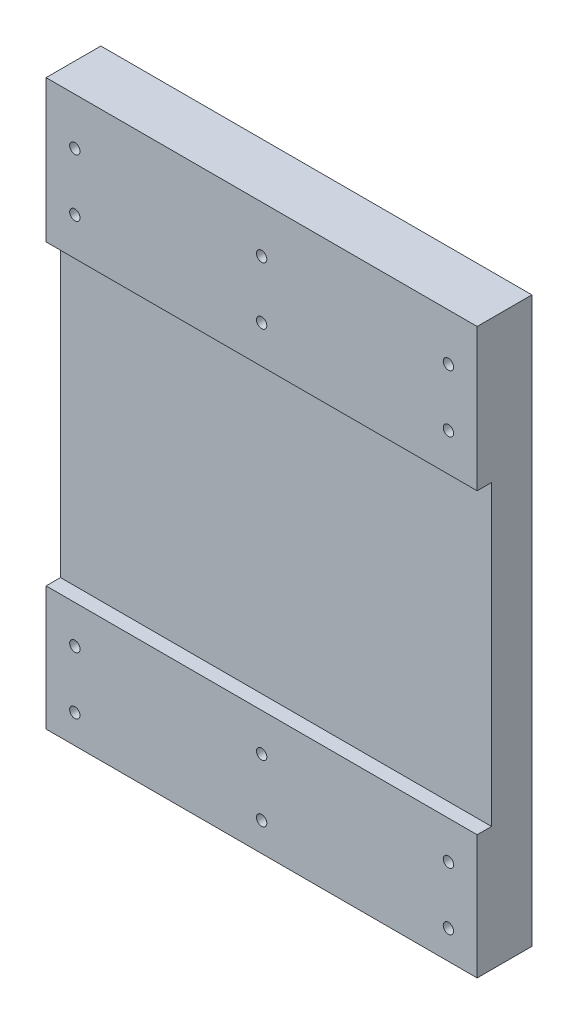
ISO-10303-21;
HEADER;
FILE_DESCRIPTION(('STEP AP214'),'2;1');
FILE_NAME('part.step','',(''),(''),'','','');
FILE_SCHEMA(('AUTOMOTIVE_DESIGN { 1 0 10303 214 1 1 1 1 }'));
ENDSEC;
DATA;
#1=APPLICATION_CONTEXT('core data for automotive mechanical design processes');
#2=APPLICATION_PROTOCOL_DEFINITION('international standard','automotive_design',2000,#1);
#3=PRODUCT_CONTEXT('',#1,'mechanical');
#4=PRODUCT('Part','Part','',(#3));
#5=PRODUCT_RELATED_PRODUCT_CATEGORY('part','',(#4));
#6=PRODUCT_DEFINITION_FORMATION('','',#4);
#7=PRODUCT_DEFINITION_CONTEXT('part definition',#1,'design');
#8=PRODUCT_DEFINITION('design','',#6,#7);
#9=PRODUCT_DEFINITION_SHAPE('','',#8);
#10=(LENGTH_UNIT() NAMED_UNIT(*) SI_UNIT(.MILLI.,.METRE.));
#11=(NAMED_UNIT(*) PLANE_ANGLE_UNIT() SI_UNIT($,.RADIAN.));
#12=(NAMED_UNIT(*) SI_UNIT($,.STERADIAN.) SOLID_ANGLE_UNIT());
#13=UNCERTAINTY_MEASURE_WITH_UNIT(LENGTH_MEASURE(1.E-05),#10,'distance_accuracy_value','');
#14=(GEOMETRIC_REPRESENTATION_CONTEXT(3) GLOBAL_UNCERTAINTY_ASSIGNED_CONTEXT((#13)) GLOBAL_UNIT_ASSIGNED_CONTEXT((#10,
#11,#12)) REPRESENTATION_CONTEXT('',''));
#15=CARTESIAN_POINT('',(0.,0.,0.));
#16=DIRECTION('',(0.,0.,1.));
#17=DIRECTION('',(1.,0.,0.));
#18=AXIS2_PLACEMENT_3D('',#15,#16,#17);
#19=CARTESIAN_POINT('',(0.,3.17500000000001,0.));
#20=DIRECTION('',(0.,0.,1.));
#21=DIRECTION('',(1.,0.,0.));
#22=AXIS2_PLACEMENT_3D('',#19,#20,#21);
#23=PLANE('',#22);
#24=CARTESIAN_POINT('',(65.,84.9999999999998,0.));
#25=DIRECTION('',(0.,0.,1.));
#26=DIRECTION('',(1.,0.,0.));
#27=AXIS2_PLACEMENT_3D('',#24,#25,#26);
#28=CIRCLE('',#27,1.8);
#29=CARTESIAN_POINT('',(66.8,84.9999999999998,0.));
#30=VERTEX_POINT('',#29);
#31=EDGE_CURVE('E323',#30,#30,#28,.T.);
#32=ORIENTED_EDGE('',*,*,#31,.F.);
#33=EDGE_LOOP('',(#32));
#34=FACE_BOUND('',#33,.T.);
#35=CARTESIAN_POINT('',(65.,64.9999999999998,0.));
#36=DIRECTION('',(0.,0.,1.));
#37=DIRECTION('',(1.,0.,0.));
#38=AXIS2_PLACEMENT_3D('',#35,#36,#37);
#39=CIRCLE('',#38,1.8);
#40=CARTESIAN_POINT('',(66.8,64.9999999999998,0.));
#41=VERTEX_POINT('',#40);
#42=EDGE_CURVE('E314',#41,#41,#39,.T.);
#43=ORIENTED_EDGE('',*,*,#42,.F.);
#44=EDGE_LOOP('',(#43));
#45=FACE_BOUND('',#44,.T.);
#46=CARTESIAN_POINT('',(-65.,64.9999999999998,0.));
#47=DIRECTION('',(0.,0.,1.));
#48=DIRECTION('',(1.,0.,0.));
#49=AXIS2_PLACEMENT_3D('',#46,#47,#48);
#50=CIRCLE('',#49,1.8);
#51=CARTESIAN_POINT('',(-63.2,64.9999999999998,0.));
#52=VERTEX_POINT('',#51);
#53=EDGE_CURVE('E302',#52,#52,#50,.T.);
#54=ORIENTED_EDGE('',*,*,#53,.F.);
#55=EDGE_LOOP('',(#54));
#56=FACE_BOUND('',#55,.T.);
#57=CARTESIAN_POINT('',(-65.,84.9999999999997,0.));
#58=DIRECTION('',(0.,0.,1.));
#59=DIRECTION('',(1.,0.,0.));
#60=AXIS2_PLACEMENT_3D('',#57,#58,#59);
#61=CIRCLE('',#60,1.8);
#62=CARTESIAN_POINT('',(-63.2,84.9999999999997,0.));
#63=VERTEX_POINT('',#62);
#64=EDGE_CURVE('E292',#63,#63,#61,.T.);
#65=ORIENTED_EDGE('',*,*,#64,.F.);
#66=EDGE_LOOP('',(#65));
#67=FACE_BOUND('',#66,.T.);
#68=CARTESIAN_POINT('',(0.,84.9999999999998,0.));
#69=DIRECTION('',(0.,0.,1.));
#70=DIRECTION('',(1.,0.,0.));
#71=AXIS2_PLACEMENT_3D('',#68,#69,#70);
#72=CIRCLE('',#71,1.8);
#73=CARTESIAN_POINT('',(1.8,84.9999999999998,0.));
#74=VERTEX_POINT('',#73);
#75=EDGE_CURVE('E267',#74,#74,#72,.T.);
#76=ORIENTED_EDGE('',*,*,#75,.F.);
#77=EDGE_LOOP('',(#76));
#78=FACE_BOUND('',#77,.T.);
#79=CARTESIAN_POINT('',(0.,64.9999999999998,0.));
#80=DIRECTION('',(0.,0.,1.));
#81=DIRECTION('',(1.,0.,0.));
#82=AXIS2_PLACEMENT_3D('',#79,#80,#81);
#83=CIRCLE('',#82,1.8);
#84=CARTESIAN_POINT('',(1.8,64.9999999999998,0.));
#85=VERTEX_POINT('',#84);
#86=EDGE_CURVE('E258',#85,#85,#83,.T.);
#87=ORIENTED_EDGE('',*,*,#86,.F.);
#88=EDGE_LOOP('',(#87));
#89=FACE_BOUND('',#88,.T.);
#90=DIRECTION('',(1.,0.,0.));
#91=VECTOR('',#90,1.);
#92=CARTESIAN_POINT('',(-75.001,51.8249999999998,0.));
#93=LINE('',#92,#91);
#94=CARTESIAN_POINT('',(-75.,51.8249999999998,0.));
#95=VERTEX_POINT('',#94);
#96=CARTESIAN_POINT('',(75.,51.8249999999999,0.));
#97=VERTEX_POINT('',#96);
#98=EDGE_CURVE('E115',#95,#97,#93,.T.);
#99=ORIENTED_EDGE('',*,*,#98,.T.);
#100=DIRECTION('',(0.,1.,0.));
#101=VECTOR('',#100,1.);
#102=CARTESIAN_POINT('',(75.0000000000001,3.17500000000001,0.));
#103=LINE('',#102,#101);
#104=CARTESIAN_POINT('',(75.,101.35,0.));
#105=VERTEX_POINT('',#104);
#106=EDGE_CURVE('E63',#97,#105,#103,.T.);
#107=ORIENTED_EDGE('',*,*,#106,.T.);
#108=DIRECTION('',(1.,0.,0.));
#109=VECTOR('',#108,1.);
#110=CARTESIAN_POINT('',(0.,101.35,0.));
#111=LINE('',#110,#109);
#112=CARTESIAN_POINT('',(-75.,101.35,0.));
#113=VERTEX_POINT('',#112);
#114=EDGE_CURVE('E11',#105,#113,#111,.F.);
#115=ORIENTED_EDGE('',*,*,#114,.T.);
#116=DIRECTION('',(0.,1.,0.));
#117=VECTOR('',#116,1.);
#118=CARTESIAN_POINT('',(-75.,3.17500000000001,0.));
#119=LINE('',#118,#117);
#120=EDGE_CURVE('E124',#113,#95,#119,.F.);
#121=ORIENTED_EDGE('',*,*,#120,.T.);
#122=EDGE_LOOP('',(#99,#107,#115,#121));
#123=FACE_BOUND('',#122,.T.);
#124=ADVANCED_FACE('F37',(#34,#45,#56,#67,#78,#89,#123),#23,.T.);
#125=CARTESIAN_POINT('',(0.,3.17500000000001,-19.05));
#126=DIRECTION('',(0.,0.,-1.));
#127=DIRECTION('',(-1.,0.,0.));
#128=AXIS2_PLACEMENT_3D('',#125,#126,#127);
#129=PLANE('',#128);
#130=CARTESIAN_POINT('',(65.,-84.9999999999998,-19.05));
#131=DIRECTION('',(0.,0.,-1.));
#132=DIRECTION('',(-1.,0.,0.));
#133=AXIS2_PLACEMENT_3D('',#130,#131,#132);
#134=CIRCLE('',#133,3.15);
#135=CARTESIAN_POINT('',(61.85,-84.9999999999998,-19.05));
#136=VERTEX_POINT('',#135);
#137=EDGE_CURVE('E343',#136,#136,#134,.T.);
#138=ORIENTED_EDGE('',*,*,#137,.F.);
#139=EDGE_LOOP('',(#138));
#140=FACE_BOUND('',#139,.T.);
#141=CARTESIAN_POINT('',(65.,-64.9999999999998,-19.05));
#142=DIRECTION('',(0.,0.,-1.));
#143=DIRECTION('',(-1.,0.,0.));
#144=AXIS2_PLACEMENT_3D('',#141,#142,#143);
#145=CIRCLE('',#144,3.15);
#146=CARTESIAN_POINT('',(61.85,-64.9999999999998,-19.05));
#147=VERTEX_POINT('',#146);
#148=EDGE_CURVE('E336',#147,#147,#145,.T.);
#149=ORIENTED_EDGE('',*,*,#148,.F.);
#150=EDGE_LOOP('',(#149));
#151=FACE_BOUND('',#150,.T.);
#152=CARTESIAN_POINT('',(65.,84.9999999999998,-19.05));
#153=DIRECTION('',(0.,0.,-1.));
#154=DIRECTION('',(-1.,0.,0.));
#155=AXIS2_PLACEMENT_3D('',#152,#153,#154);
#156=CIRCLE('',#155,3.15);
#157=CARTESIAN_POINT('',(61.85,84.9999999999998,-19.05));
#158=VERTEX_POINT('',#157);
#159=EDGE_CURVE('E329',#158,#158,#156,.T.);
#160=ORIENTED_EDGE('',*,*,#159,.F.);
#161=EDGE_LOOP('',(#160));
#162=FACE_BOUND('',#161,.T.);
#163=CARTESIAN_POINT('',(65.,64.9999999999998,-19.05));
#164=DIRECTION('',(0.,0.,-1.));
#165=DIRECTION('',(-1.,0.,0.));
#166=AXIS2_PLACEMENT_3D('',#163,#164,#165);
#167=CIRCLE('',#166,3.15);
#168=CARTESIAN_POINT('',(61.85,64.9999999999998,-19.05));
#169=VERTEX_POINT('',#168);
#170=EDGE_CURVE('E320',#169,#169,#167,.T.);
#171=ORIENTED_EDGE('',*,*,#170,.F.);
#172=EDGE_LOOP('',(#171));
#173=FACE_BOUND('',#172,.T.);
#174=CARTESIAN_POINT('',(-65.,64.9999999999998,-19.05));
#175=DIRECTION('',(0.,0.,-1.));
#176=DIRECTION('',(-1.,0.,0.));
#177=AXIS2_PLACEMENT_3D('',#174,#175,#176);
#178=CIRCLE('',#177,3.15);
#179=CARTESIAN_POINT('',(-68.15,64.9999999999998,-19.05));
#180=VERTEX_POINT('',#179);
#181=EDGE_CURVE('E310',#180,#180,#178,.T.);
#182=ORIENTED_EDGE('',*,*,#181,.F.);
#183=EDGE_LOOP('',(#182));
#184=FACE_BOUND('',#183,.T.);
#185=CARTESIAN_POINT('',(-65.,84.9999999999997,-19.05));
#186=DIRECTION('',(0.,0.,-1.));
#187=DIRECTION('',(-1.,0.,0.));
#188=AXIS2_PLACEMENT_3D('',#185,#186,#187);
#189=CIRCLE('',#188,3.15);
#190=CARTESIAN_POINT('',(-68.15,84.9999999999997,-19.05));
#191=VERTEX_POINT('',#190);
#192=EDGE_CURVE('E298',#191,#191,#189,.T.);
#193=ORIENTED_EDGE('',*,*,#192,.F.);
#194=EDGE_LOOP('',(#193));
#195=FACE_BOUND('',#194,.T.);
#196=CARTESIAN_POINT('',(-65.,-64.9999999999998,-19.05));
#197=DIRECTION('',(0.,0.,-1.));
#198=DIRECTION('',(-1.,0.,0.));
#199=AXIS2_PLACEMENT_3D('',#196,#197,#198);
#200=CIRCLE('',#199,3.15);
#201=CARTESIAN_POINT('',(-68.15,-64.9999999999998,-19.05));
#202=VERTEX_POINT('',#201);
#203=EDGE_CURVE('E288',#202,#202,#200,.T.);
#204=ORIENTED_EDGE('',*,*,#203,.F.);
#205=EDGE_LOOP('',(#204));
#206=FACE_BOUND('',#205,.T.);
#207=CARTESIAN_POINT('',(-65.,-84.9999999999997,-19.05));
#208=DIRECTION('',(0.,0.,-1.));
#209=DIRECTION('',(-1.,0.,0.));
#210=AXIS2_PLACEMENT_3D('',#207,#208,#209);
#211=CIRCLE('',#210,3.15);
#212=CARTESIAN_POINT('',(-68.15,-84.9999999999997,-19.05));
#213=VERTEX_POINT('',#212);
#214=EDGE_CURVE('E280',#213,#213,#211,.T.);
#215=ORIENTED_EDGE('',*,*,#214,.F.);
#216=EDGE_LOOP('',(#215));
#217=FACE_BOUND('',#216,.T.);
#218=CARTESIAN_POINT('',(0.,84.9999999999998,-19.05));
#219=DIRECTION('',(0.,0.,-1.));
#220=DIRECTION('',(-1.,0.,0.));
#221=AXIS2_PLACEMENT_3D('',#218,#219,#220);
#222=CIRCLE('',#221,3.15);
#223=CARTESIAN_POINT('',(-3.15,84.9999999999998,-19.05));
#224=VERTEX_POINT('',#223);
#225=EDGE_CURVE('E273',#224,#224,#222,.T.);
#226=ORIENTED_EDGE('',*,*,#225,.F.);
#227=EDGE_LOOP('',(#226));
#228=FACE_BOUND('',#227,.T.);
#229=CARTESIAN_POINT('',(0.,64.9999999999998,-19.05));
#230=DIRECTION('',(0.,0.,-1.));
#231=DIRECTION('',(-1.,0.,0.));
#232=AXIS2_PLACEMENT_3D('',#229,#230,#231);
#233=CIRCLE('',#232,3.15);
#234=CARTESIAN_POINT('',(-3.15,64.9999999999998,-19.05));
#235=VERTEX_POINT('',#234);
#236=EDGE_CURVE('E264',#235,#235,#233,.T.);
#237=ORIENTED_EDGE('',*,*,#236,.F.);
#238=EDGE_LOOP('',(#237));
#239=FACE_BOUND('',#238,.T.);
#240=CARTESIAN_POINT('',(0.,-64.9999999999998,-19.05));
#241=DIRECTION('',(0.,0.,-1.));
#242=DIRECTION('',(-1.,0.,0.));
#243=AXIS2_PLACEMENT_3D('',#240,#241,#242);
#244=CIRCLE('',#243,3.15);
#245=CARTESIAN_POINT('',(-3.15,-64.9999999999998,-19.05));
#246=VERTEX_POINT('',#245);
#247=EDGE_CURVE('E255',#246,#246,#244,.T.);
#248=ORIENTED_EDGE('',*,*,#247,.F.);
#249=EDGE_LOOP('',(#248));
#250=FACE_BOUND('',#249,.T.);
#251=CARTESIAN_POINT('',(0.,-84.9999999999998,-19.05));
#252=DIRECTION('',(0.,0.,-1.));
#253=DIRECTION('',(-1.,0.,0.));
#254=AXIS2_PLACEMENT_3D('',#251,#252,#253);
#255=CIRCLE('',#254,3.15);
#256=CARTESIAN_POINT('',(-3.15,-84.9999999999998,-19.05));
#257=VERTEX_POINT('',#256);
#258=EDGE_CURVE('E246',#257,#257,#255,.T.);
#259=ORIENTED_EDGE('',*,*,#258,.F.);
#260=EDGE_LOOP('',(#259));
#261=FACE_BOUND('',#260,.T.);
#262=DIRECTION('',(0.,1.,0.));
#263=VECTOR('',#262,1.);
#264=CARTESIAN_POINT('',(75.,101.35,-19.05));
#265=LINE('',#264,#263);
#266=CARTESIAN_POINT('',(75.0000000000001,-94.9999999999998,-19.05));
#267=VERTEX_POINT('',#266);
#268=CARTESIAN_POINT('',(75.,101.35,-19.05));
#269=VERTEX_POINT('',#268);
#270=EDGE_CURVE('E147',#267,#269,#265,.T.);
#271=ORIENTED_EDGE('',*,*,#270,.F.);
#272=DIRECTION('',(1.,0.,0.));
#273=VECTOR('',#272,1.);
#274=CARTESIAN_POINT('',(75.0000000000001,-94.9999999999998,-19.05));
#275=LINE('',#274,#273);
#276=CARTESIAN_POINT('',(-75.,-94.9999999999998,-19.05));
#277=VERTEX_POINT('',#276);
#278=EDGE_CURVE('E152',#277,#267,#275,.T.);
#279=ORIENTED_EDGE('',*,*,#278,.F.);
#280=DIRECTION('',(0.,1.,0.));
#281=VECTOR('',#280,1.);
#282=CARTESIAN_POINT('',(-75.,-94.9999999999998,-19.05));
#283=LINE('',#282,#281);
#284=CARTESIAN_POINT('',(-75.,101.35,-19.05));
#285=VERTEX_POINT('',#284);
#286=EDGE_CURVE('E41',#285,#277,#283,.F.);
#287=ORIENTED_EDGE('',*,*,#286,.F.);
#288=DIRECTION('',(1.,0.,0.));
#289=VECTOR('',#288,1.);
#290=CARTESIAN_POINT('',(-75.,101.35,-19.05));
#291=LINE('',#290,#289);
#292=EDGE_CURVE('E141',#269,#285,#291,.F.);
#293=ORIENTED_EDGE('',*,*,#292,.F.);
#294=EDGE_LOOP('',(#271,#279,#287,#293));
#295=FACE_BOUND('',#294,.T.);
#296=ADVANCED_FACE('F39',(#140,#151,#162,#173,#184,#195,#206,#217,#228,#239,#250,#261,#295),
#129,.T.);
#297=CARTESIAN_POINT('',(-75.,-94.9999999999998,0.));
#298=DIRECTION('',(-1.,0.,0.));
#299=DIRECTION('',(0.,0.,1.));
#300=AXIS2_PLACEMENT_3D('',#297,#298,#299);
#301=PLANE('',#300);
#302=DIRECTION('',(0.,0.,1.));
#303=VECTOR('',#302,1.);
#304=CARTESIAN_POINT('',(-75.,51.8249999999998,0.));
#305=LINE('',#304,#303);
#306=CARTESIAN_POINT('',(-75.,51.8249999999999,-5.));
#307=VERTEX_POINT('',#306);
#308=EDGE_CURVE('E118',#307,#95,#305,.T.);
#309=ORIENTED_EDGE('',*,*,#308,.T.);
#310=ORIENTED_EDGE('',*,*,#120,.F.);
#311=DIRECTION('',(0.,0.,1.));
#312=VECTOR('',#311,1.);
#313=CARTESIAN_POINT('',(-75.,101.35,0.));
#314=LINE('',#313,#312);
#315=EDGE_CURVE('E137',#285,#113,#314,.T.);
#316=ORIENTED_EDGE('',*,*,#315,.F.);
#317=ORIENTED_EDGE('',*,*,#286,.T.);
#318=DIRECTION('',(0.,0.,-1.));
#319=VECTOR('',#318,1.);
#320=CARTESIAN_POINT('',(-75.,-94.9999999999998,0.));
#321=LINE('',#320,#319);
#322=CARTESIAN_POINT('',(-75.,-94.9999999999998,0.));
#323=VERTEX_POINT('',#322);
#324=EDGE_CURVE('E153',#323,#277,#321,.T.);
#325=ORIENTED_EDGE('',*,*,#324,.F.);
#326=CARTESIAN_POINT('',(-75.,-51.8249999999998,0.));
#327=VERTEX_POINT('',#326);
#328=EDGE_CURVE('E131',#327,#323,#119,.F.);
#329=ORIENTED_EDGE('',*,*,#328,.F.);
#330=DIRECTION('',(0.,0.,-1.));
#331=VECTOR('',#330,1.);
#332=CARTESIAN_POINT('',(-75.,-51.8249999999998,0.));
#333=LINE('',#332,#331);
#334=CARTESIAN_POINT('',(-75.,-51.8249999999998,-5.));
#335=VERTEX_POINT('',#334);
#336=EDGE_CURVE('E55',#327,#335,#333,.T.);
#337=ORIENTED_EDGE('',*,*,#336,.T.);
#338=DIRECTION('',(0.,1.,0.));
#339=VECTOR('',#338,1.);
#340=CARTESIAN_POINT('',(-75.,-51.8249999999998,-5.));
#341=LINE('',#340,#339);
#342=EDGE_CURVE('E97',#335,#307,#341,.T.);
#343=ORIENTED_EDGE('',*,*,#342,.T.);
#344=EDGE_LOOP('',(#309,#310,#316,#317,#325,#329,#337,#343));
#345=FACE_BOUND('',#344,.T.);
#346=ADVANCED_FACE('F123',(#345),#301,.T.);
#347=CARTESIAN_POINT('',(75.0000000000001,-94.9999999999998,0.));
#348=DIRECTION('',(0.,-1.,0.));
#349=DIRECTION('',(0.,0.,-1.));
#350=AXIS2_PLACEMENT_3D('',#347,#348,#349);
#351=PLANE('',#350);
#352=ORIENTED_EDGE('',*,*,#278,.T.);
#353=DIRECTION('',(0.,0.,1.));
#354=VECTOR('',#353,1.);
#355=CARTESIAN_POINT('',(75.,-94.9999999999998,0.));
#356=LINE('',#355,#354);
#357=CARTESIAN_POINT('',(75.0000000000001,-94.9999999999998,0.));
#358=VERTEX_POINT('',#357);
#359=EDGE_CURVE('E149',#358,#267,#356,.F.);
#360=ORIENTED_EDGE('',*,*,#359,.F.);
#361=DIRECTION('',(1.,0.,0.));
#362=VECTOR('',#361,1.);
#363=CARTESIAN_POINT('',(0.,-94.9999999999998,0.));
#364=LINE('',#363,#362);
#365=EDGE_CURVE('E130',#323,#358,#364,.T.);
#366=ORIENTED_EDGE('',*,*,#365,.F.);
#367=ORIENTED_EDGE('',*,*,#324,.T.);
#368=EDGE_LOOP('',(#352,#360,#366,#367));
#369=FACE_BOUND('',#368,.T.);
#370=ADVANCED_FACE('F373',(#369),#351,.T.);
#371=CARTESIAN_POINT('',(75.,101.35,0.));
#372=DIRECTION('',(1.,0.,0.));
#373=DIRECTION('',(0.,1.,0.));
#374=AXIS2_PLACEMENT_3D('',#371,#372,#373);
#375=PLANE('',#374);
#376=DIRECTION('',(0.,0.,1.));
#377=VECTOR('',#376,1.);
#378=CARTESIAN_POINT('',(75.,51.8249999999999,0.));
#379=LINE('',#378,#377);
#380=CARTESIAN_POINT('',(75.,51.8249999999999,-5.));
#381=VERTEX_POINT('',#380);
#382=EDGE_CURVE('E104',#381,#97,#379,.T.);
#383=ORIENTED_EDGE('',*,*,#382,.F.);
#384=DIRECTION('',(0.,1.,0.));
#385=VECTOR('',#384,1.);
#386=CARTESIAN_POINT('',(75.,-51.8249999999998,-5.));
#387=LINE('',#386,#385);
#388=CARTESIAN_POINT('',(75.,-51.8249999999998,-5.));
#389=VERTEX_POINT('',#388);
#390=EDGE_CURVE('E174',#389,#381,#387,.T.);
#391=ORIENTED_EDGE('',*,*,#390,.F.);
#392=DIRECTION('',(0.,0.,-1.));
#393=VECTOR('',#392,1.);
#394=CARTESIAN_POINT('',(75.,-51.8249999999998,0.));
#395=LINE('',#394,#393);
#396=CARTESIAN_POINT('',(75.,-51.8249999999998,0.));
#397=VERTEX_POINT('',#396);
#398=EDGE_CURVE('E126',#397,#389,#395,.T.);
#399=ORIENTED_EDGE('',*,*,#398,.F.);
#400=EDGE_CURVE('E47',#358,#397,#103,.T.);
#401=ORIENTED_EDGE('',*,*,#400,.F.);
#402=ORIENTED_EDGE('',*,*,#359,.T.);
#403=ORIENTED_EDGE('',*,*,#270,.T.);
#404=DIRECTION('',(0.,0.,1.));
#405=VECTOR('',#404,1.);
#406=CARTESIAN_POINT('',(75.,101.35,0.));
#407=LINE('',#406,#405);
#408=EDGE_CURVE('E144',#105,#269,#407,.F.);
#409=ORIENTED_EDGE('',*,*,#408,.F.);
#410=ORIENTED_EDGE('',*,*,#106,.F.);
#411=EDGE_LOOP('',(#383,#391,#399,#401,#402,#403,#409,#410));
#412=FACE_BOUND('',#411,.T.);
#413=ADVANCED_FACE('F170',(#412),#375,.T.);
#414=CARTESIAN_POINT('',(-75.,101.35,0.));
#415=DIRECTION('',(0.,1.,0.));
#416=DIRECTION('',(0.,0.,1.));
#417=AXIS2_PLACEMENT_3D('',#414,#415,#416);
#418=PLANE('',#417);
#419=ORIENTED_EDGE('',*,*,#292,.T.);
#420=ORIENTED_EDGE('',*,*,#315,.T.);
#421=ORIENTED_EDGE('',*,*,#114,.F.);
#422=ORIENTED_EDGE('',*,*,#408,.T.);
#423=EDGE_LOOP('',(#419,#420,#421,#422));
#424=FACE_BOUND('',#423,.T.);
#425=ADVANCED_FACE('F208',(#424),#418,.T.);
#426=CARTESIAN_POINT('',(65.,-84.9999999999998,0.));
#427=DIRECTION('',(0.,0.,1.));
#428=DIRECTION('',(1.,0.,0.));
#429=AXIS2_PLACEMENT_3D('',#426,#427,#428);
#430=CIRCLE('',#429,1.8);
#431=CARTESIAN_POINT('',(66.8,-84.9999999999998,0.));
#432=VERTEX_POINT('',#431);
#433=EDGE_CURVE('E221',#432,#432,#430,.T.);
#434=ORIENTED_EDGE('',*,*,#433,.F.);
#435=EDGE_LOOP('',(#434));
#436=FACE_BOUND('',#435,.T.);
#437=CARTESIAN_POINT('',(65.,-64.9999999999998,0.));
#438=DIRECTION('',(0.,0.,1.));
#439=DIRECTION('',(1.,0.,0.));
#440=AXIS2_PLACEMENT_3D('',#437,#438,#439);
#441=CIRCLE('',#440,1.8);
#442=CARTESIAN_POINT('',(66.8,-64.9999999999998,0.));
#443=VERTEX_POINT('',#442);
#444=EDGE_CURVE('E225',#443,#443,#441,.T.);
#445=ORIENTED_EDGE('',*,*,#444,.F.);
#446=EDGE_LOOP('',(#445));
#447=FACE_BOUND('',#446,.T.);
#448=CARTESIAN_POINT('',(-65.,-64.9999999999998,0.));
#449=DIRECTION('',(0.,0.,1.));
#450=DIRECTION('',(1.,0.,0.));
#451=AXIS2_PLACEMENT_3D('',#448,#449,#450);
#452=CIRCLE('',#451,1.8);
#453=CARTESIAN_POINT('',(-63.2,-64.9999999999998,0.));
#454=VERTEX_POINT('',#453);
#455=EDGE_CURVE('E229',#454,#454,#452,.T.);
#456=ORIENTED_EDGE('',*,*,#455,.F.);
#457=EDGE_LOOP('',(#456));
#458=FACE_BOUND('',#457,.T.);
#459=CARTESIAN_POINT('',(-65.,-84.9999999999997,0.));
#460=DIRECTION('',(0.,0.,1.));
#461=DIRECTION('',(1.,0.,0.));
#462=AXIS2_PLACEMENT_3D('',#459,#460,#461);
#463=CIRCLE('',#462,1.8);
#464=CARTESIAN_POINT('',(-63.2,-84.9999999999997,0.));
#465=VERTEX_POINT('',#464);
#466=EDGE_CURVE('E233',#465,#465,#463,.T.);
#467=ORIENTED_EDGE('',*,*,#466,.F.);
#468=EDGE_LOOP('',(#467));
#469=FACE_BOUND('',#468,.T.);
#470=CARTESIAN_POINT('',(0.,-64.9999999999998,0.));
#471=DIRECTION('',(0.,0.,1.));
#472=DIRECTION('',(1.,0.,0.));
#473=AXIS2_PLACEMENT_3D('',#470,#471,#472);
#474=CIRCLE('',#473,1.8);
#475=CARTESIAN_POINT('',(1.8,-64.9999999999998,0.));
#476=VERTEX_POINT('',#475);
#477=EDGE_CURVE('E237',#476,#476,#474,.T.);
#478=ORIENTED_EDGE('',*,*,#477,.F.);
#479=EDGE_LOOP('',(#478));
#480=FACE_BOUND('',#479,.T.);
#481=CARTESIAN_POINT('',(0.,-84.9999999999998,0.));
#482=DIRECTION('',(0.,0.,1.));
#483=DIRECTION('',(1.,0.,0.));
#484=AXIS2_PLACEMENT_3D('',#481,#482,#483);
#485=CIRCLE('',#484,1.8);
#486=CARTESIAN_POINT('',(1.8,-84.9999999999998,0.));
#487=VERTEX_POINT('',#486);
#488=EDGE_CURVE('E240',#487,#487,#485,.T.);
#489=ORIENTED_EDGE('',*,*,#488,.F.);
#490=EDGE_LOOP('',(#489));
#491=FACE_BOUND('',#490,.T.);
#492=DIRECTION('',(1.,0.,0.));
#493=VECTOR('',#492,1.);
#494=CARTESIAN_POINT('',(-75.001,-51.8249999999998,0.));
#495=LINE('',#494,#493);
#496=EDGE_CURVE('E162',#327,#397,#495,.T.);
#497=ORIENTED_EDGE('',*,*,#496,.F.);
#498=ORIENTED_EDGE('',*,*,#328,.T.);
#499=ORIENTED_EDGE('',*,*,#365,.T.);
#500=ORIENTED_EDGE('',*,*,#400,.T.);
#501=EDGE_LOOP('',(#497,#498,#499,#500));
#502=FACE_BOUND('',#501,.T.);
#503=ADVANCED_FACE('F167',(#436,#447,#458,#469,#480,#491,#502),#23,.T.);
#504=CARTESIAN_POINT('',(-75.001,51.8249999999998,0.));
#505=DIRECTION('',(0.,1.,0.));
#506=DIRECTION('',(-1.,0.,0.));
#507=AXIS2_PLACEMENT_3D('',#504,#505,#506);
#508=PLANE('',#507);
#509=DIRECTION('',(1.,0.,0.));
#510=VECTOR('',#509,1.);
#511=CARTESIAN_POINT('',(-75.001,51.8249999999998,-5.));
#512=LINE('',#511,#510);
#513=EDGE_CURVE('E121',#307,#381,#512,.T.);
#514=ORIENTED_EDGE('',*,*,#513,.T.);
#515=ORIENTED_EDGE('',*,*,#382,.T.);
#516=ORIENTED_EDGE('',*,*,#98,.F.);
#517=ORIENTED_EDGE('',*,*,#308,.F.);
#518=EDGE_LOOP('',(#514,#515,#516,#517));
#519=FACE_BOUND('',#518,.T.);
#520=ADVANCED_FACE('F117',(#519),#508,.F.);
#521=CARTESIAN_POINT('',(-75.001,-51.8249999999998,-5.));
#522=DIRECTION('',(0.,0.,-1.));
#523=DIRECTION('',(-1.,0.,0.));
#524=AXIS2_PLACEMENT_3D('',#521,#522,#523);
#525=PLANE('',#524);
#526=DIRECTION('',(1.,0.,0.));
#527=VECTOR('',#526,1.);
#528=CARTESIAN_POINT('',(-75.001,-51.8249999999998,-5.));
#529=LINE('',#528,#527);
#530=EDGE_CURVE('E181',#335,#389,#529,.T.);
#531=ORIENTED_EDGE('',*,*,#530,.T.);
#532=ORIENTED_EDGE('',*,*,#390,.T.);
#533=ORIENTED_EDGE('',*,*,#513,.F.);
#534=ORIENTED_EDGE('',*,*,#342,.F.);
#535=EDGE_LOOP('',(#531,#532,#533,#534));
#536=FACE_BOUND('',#535,.T.);
#537=ADVANCED_FACE('F185',(#536),#525,.F.);
#538=CARTESIAN_POINT('',(-75.001,-51.8249999999998,0.));
#539=DIRECTION('',(0.,-1.,0.));
#540=DIRECTION('',(1.,0.,0.));
#541=AXIS2_PLACEMENT_3D('',#538,#539,#540);
#542=PLANE('',#541);
#543=ORIENTED_EDGE('',*,*,#496,.T.);
#544=ORIENTED_EDGE('',*,*,#398,.T.);
#545=ORIENTED_EDGE('',*,*,#530,.F.);
#546=ORIENTED_EDGE('',*,*,#336,.F.);
#547=EDGE_LOOP('',(#543,#544,#545,#546));
#548=FACE_BOUND('',#547,.T.);
#549=ADVANCED_FACE('F182',(#548),#542,.F.);
#550=CARTESIAN_POINT('',(0.,-84.9999999999998,-19.05));
#551=DIRECTION('',(0.,0.,-1.));
#552=DIRECTION('',(-1.,0.,0.));
#553=AXIS2_PLACEMENT_3D('',#550,#551,#552);
#554=CYLINDRICAL_SURFACE('',#553,1.8);
#555=CARTESIAN_POINT('',(0.,-84.9999999999998,-17.7));
#556=DIRECTION('',(0.,0.,-1.));
#557=DIRECTION('',(-1.,0.,0.));
#558=AXIS2_PLACEMENT_3D('',#555,#556,#557);
#559=CIRCLE('',#558,1.8);
#560=CARTESIAN_POINT('',(-1.8,-84.9999999999998,-17.7));
#561=VERTEX_POINT('',#560);
#562=EDGE_CURVE('E242',#561,#561,#559,.T.);
#563=ORIENTED_EDGE('',*,*,#562,.T.);
#564=EDGE_LOOP('',(#563));
#565=FACE_BOUND('',#564,.T.);
#566=ORIENTED_EDGE('',*,*,#488,.T.);
#567=EDGE_LOOP('',(#566));
#568=FACE_BOUND('',#567,.T.);
#569=ADVANCED_FACE('F184',(#565,#568),#554,.F.);
#570=CARTESIAN_POINT('',(0.,-84.9999999999998,-19.05));
#571=DIRECTION('',(0.,0.,-1.));
#572=DIRECTION('',(-1.,0.,0.));
#573=AXIS2_PLACEMENT_3D('',#570,#571,#572);
#574=CONICAL_SURFACE('',#573,3.15,0.785398163397448);
#575=ORIENTED_EDGE('',*,*,#562,.F.);
#576=EDGE_LOOP('',(#575));
#577=FACE_BOUND('',#576,.T.);
#578=ORIENTED_EDGE('',*,*,#258,.T.);
#579=EDGE_LOOP('',(#578));
#580=FACE_BOUND('',#579,.T.);
#581=ADVANCED_FACE('F191',(#577,#580),#574,.F.);
#582=CARTESIAN_POINT('',(0.,-64.9999999999998,-19.05));
#583=DIRECTION('',(0.,0.,-1.));
#584=DIRECTION('',(-1.,0.,0.));
#585=AXIS2_PLACEMENT_3D('',#582,#583,#584);
#586=CYLINDRICAL_SURFACE('',#585,1.8);
#587=CARTESIAN_POINT('',(0.,-64.9999999999998,-17.7));
#588=DIRECTION('',(0.,0.,-1.));
#589=DIRECTION('',(-1.,0.,0.));
#590=AXIS2_PLACEMENT_3D('',#587,#588,#589);
#591=CIRCLE('',#590,1.8);
#592=CARTESIAN_POINT('',(-1.8,-64.9999999999998,-17.7));
#593=VERTEX_POINT('',#592);
#594=EDGE_CURVE('E252',#593,#593,#591,.T.);
#595=ORIENTED_EDGE('',*,*,#594,.T.);
#596=EDGE_LOOP('',(#595));
#597=FACE_BOUND('',#596,.T.);
#598=ORIENTED_EDGE('',*,*,#477,.T.);
#599=EDGE_LOOP('',(#598));
#600=FACE_BOUND('',#599,.T.);
#601=ADVANCED_FACE('F459',(#597,#600),#586,.F.);
#602=CARTESIAN_POINT('',(0.,-64.9999999999998,-19.05));
#603=DIRECTION('',(0.,0.,-1.));
#604=DIRECTION('',(-1.,0.,0.));
#605=AXIS2_PLACEMENT_3D('',#602,#603,#604);
#606=CONICAL_SURFACE('',#605,3.15,0.785398163397448);
#607=ORIENTED_EDGE('',*,*,#594,.F.);
#608=EDGE_LOOP('',(#607));
#609=FACE_BOUND('',#608,.T.);
#610=ORIENTED_EDGE('',*,*,#247,.T.);
#611=EDGE_LOOP('',(#610));
#612=FACE_BOUND('',#611,.T.);
#613=ADVANCED_FACE('F468',(#609,#612),#606,.F.);
#614=CARTESIAN_POINT('',(0.,64.9999999999998,-19.05));
#615=DIRECTION('',(0.,0.,-1.));
#616=DIRECTION('',(-1.,0.,0.));
#617=AXIS2_PLACEMENT_3D('',#614,#615,#616);
#618=CYLINDRICAL_SURFACE('',#617,1.8);
#619=CARTESIAN_POINT('',(0.,64.9999999999998,-17.7));
#620=DIRECTION('',(0.,0.,-1.));
#621=DIRECTION('',(-1.,0.,0.));
#622=AXIS2_PLACEMENT_3D('',#619,#620,#621);
#623=CIRCLE('',#622,1.8);
#624=CARTESIAN_POINT('',(-1.8,64.9999999999998,-17.7));
#625=VERTEX_POINT('',#624);
#626=EDGE_CURVE('E261',#625,#625,#623,.T.);
#627=ORIENTED_EDGE('',*,*,#626,.T.);
#628=EDGE_LOOP('',(#627));
#629=FACE_BOUND('',#628,.T.);
#630=ORIENTED_EDGE('',*,*,#86,.T.);
#631=EDGE_LOOP('',(#630));
#632=FACE_BOUND('',#631,.T.);
#633=ADVANCED_FACE('F477',(#629,#632),#618,.F.);
#634=CARTESIAN_POINT('',(0.,64.9999999999998,-19.05));
#635=DIRECTION('',(0.,0.,-1.));
#636=DIRECTION('',(-1.,0.,0.));
#637=AXIS2_PLACEMENT_3D('',#634,#635,#636);
#638=CONICAL_SURFACE('',#637,3.15,0.785398163397448);
#639=ORIENTED_EDGE('',*,*,#626,.F.);
#640=EDGE_LOOP('',(#639));
#641=FACE_BOUND('',#640,.T.);
#642=ORIENTED_EDGE('',*,*,#236,.T.);
#643=EDGE_LOOP('',(#642));
#644=FACE_BOUND('',#643,.T.);
#645=ADVANCED_FACE('F486',(#641,#644),#638,.F.);
#646=CARTESIAN_POINT('',(0.,84.9999999999998,-19.05));
#647=DIRECTION('',(0.,0.,-1.));
#648=DIRECTION('',(-1.,0.,0.));
#649=AXIS2_PLACEMENT_3D('',#646,#647,#648);
#650=CYLINDRICAL_SURFACE('',#649,1.8);
#651=CARTESIAN_POINT('',(0.,84.9999999999998,-17.7));
#652=DIRECTION('',(0.,0.,-1.));
#653=DIRECTION('',(-1.,0.,0.));
#654=AXIS2_PLACEMENT_3D('',#651,#652,#653);
#655=CIRCLE('',#654,1.8);
#656=CARTESIAN_POINT('',(-1.8,84.9999999999998,-17.7));
#657=VERTEX_POINT('',#656);
#658=EDGE_CURVE('E270',#657,#657,#655,.T.);
#659=ORIENTED_EDGE('',*,*,#658,.T.);
#660=EDGE_LOOP('',(#659));
#661=FACE_BOUND('',#660,.T.);
#662=ORIENTED_EDGE('',*,*,#75,.T.);
#663=EDGE_LOOP('',(#662));
#664=FACE_BOUND('',#663,.T.);
#665=ADVANCED_FACE('F495',(#661,#664),#650,.F.);
#666=CARTESIAN_POINT('',(0.,84.9999999999998,-19.05));
#667=DIRECTION('',(0.,0.,-1.));
#668=DIRECTION('',(-1.,0.,0.));
#669=AXIS2_PLACEMENT_3D('',#666,#667,#668);
#670=CONICAL_SURFACE('',#669,3.15,0.785398163397448);
#671=ORIENTED_EDGE('',*,*,#658,.F.);
#672=EDGE_LOOP('',(#671));
#673=FACE_BOUND('',#672,.T.);
#674=ORIENTED_EDGE('',*,*,#225,.T.);
#675=EDGE_LOOP('',(#674));
#676=FACE_BOUND('',#675,.T.);
#677=ADVANCED_FACE('F504',(#673,#676),#670,.F.);
#678=CARTESIAN_POINT('',(-65.,-84.9999999999997,-19.05));
#679=DIRECTION('',(0.,0.,-1.));
#680=DIRECTION('',(-1.,0.,0.));
#681=AXIS2_PLACEMENT_3D('',#678,#679,#680);
#682=CYLINDRICAL_SURFACE('',#681,1.8);
#683=CARTESIAN_POINT('',(-65.,-84.9999999999997,-17.7));
#684=DIRECTION('',(0.,0.,-1.));
#685=DIRECTION('',(-1.,0.,0.));
#686=AXIS2_PLACEMENT_3D('',#683,#684,#685);
#687=CIRCLE('',#686,1.8);
#688=CARTESIAN_POINT('',(-66.8,-84.9999999999997,-17.7));
#689=VERTEX_POINT('',#688);
#690=EDGE_CURVE('E277',#689,#689,#687,.T.);
#691=ORIENTED_EDGE('',*,*,#690,.T.);
#692=EDGE_LOOP('',(#691));
#693=FACE_BOUND('',#692,.T.);
#694=ORIENTED_EDGE('',*,*,#466,.T.);
#695=EDGE_LOOP('',(#694));
#696=FACE_BOUND('',#695,.T.);
#697=ADVANCED_FACE('F513',(#693,#696),#682,.F.);
#698=CARTESIAN_POINT('',(-65.,-84.9999999999997,-19.05));
#699=DIRECTION('',(0.,0.,-1.));
#700=DIRECTION('',(-1.,0.,0.));
#701=AXIS2_PLACEMENT_3D('',#698,#699,#700);
#702=CONICAL_SURFACE('',#701,3.15,0.785398163397448);
#703=ORIENTED_EDGE('',*,*,#690,.F.);
#704=EDGE_LOOP('',(#703));
#705=FACE_BOUND('',#704,.T.);
#706=ORIENTED_EDGE('',*,*,#214,.T.);
#707=EDGE_LOOP('',(#706));
#708=FACE_BOUND('',#707,.T.);
#709=ADVANCED_FACE('F522',(#705,#708),#702,.F.);
#710=CARTESIAN_POINT('',(-65.,-64.9999999999998,-19.05));
#711=DIRECTION('',(0.,0.,-1.));
#712=DIRECTION('',(-1.,0.,0.));
#713=AXIS2_PLACEMENT_3D('',#710,#711,#712);
#714=CYLINDRICAL_SURFACE('',#713,1.8);
#715=CARTESIAN_POINT('',(-65.,-64.9999999999998,-17.7));
#716=DIRECTION('',(0.,0.,-1.));
#717=DIRECTION('',(-1.,0.,0.));
#718=AXIS2_PLACEMENT_3D('',#715,#716,#717);
#719=CIRCLE('',#718,1.8);
#720=CARTESIAN_POINT('',(-66.8,-64.9999999999998,-17.7));
#721=VERTEX_POINT('',#720);
#722=EDGE_CURVE('E284',#721,#721,#719,.T.);
#723=ORIENTED_EDGE('',*,*,#722,.T.);
#724=EDGE_LOOP('',(#723));
#725=FACE_BOUND('',#724,.T.);
#726=ORIENTED_EDGE('',*,*,#455,.T.);
#727=EDGE_LOOP('',(#726));
#728=FACE_BOUND('',#727,.T.);
#729=ADVANCED_FACE('F531',(#725,#728),#714,.F.);
#730=CARTESIAN_POINT('',(-65.,-64.9999999999998,-19.05));
#731=DIRECTION('',(0.,0.,-1.));
#732=DIRECTION('',(-1.,0.,0.));
#733=AXIS2_PLACEMENT_3D('',#730,#731,#732);
#734=CONICAL_SURFACE('',#733,3.15,0.785398163397448);
#735=ORIENTED_EDGE('',*,*,#722,.F.);
#736=EDGE_LOOP('',(#735));
#737=FACE_BOUND('',#736,.T.);
#738=ORIENTED_EDGE('',*,*,#203,.T.);
#739=EDGE_LOOP('',(#738));
#740=FACE_BOUND('',#739,.T.);
#741=ADVANCED_FACE('F540',(#737,#740),#734,.F.);
#742=CARTESIAN_POINT('',(-65.,84.9999999999997,-19.05));
#743=DIRECTION('',(0.,0.,-1.));
#744=DIRECTION('',(-1.,0.,0.));
#745=AXIS2_PLACEMENT_3D('',#742,#743,#744);
#746=CYLINDRICAL_SURFACE('',#745,1.8);
#747=CARTESIAN_POINT('',(-65.,84.9999999999997,-17.7));
#748=DIRECTION('',(0.,0.,-1.));
#749=DIRECTION('',(-1.,0.,0.));
#750=AXIS2_PLACEMENT_3D('',#747,#748,#749);
#751=CIRCLE('',#750,1.8);
#752=CARTESIAN_POINT('',(-66.8,84.9999999999997,-17.7));
#753=VERTEX_POINT('',#752);
#754=EDGE_CURVE('E295',#753,#753,#751,.T.);
#755=ORIENTED_EDGE('',*,*,#754,.T.);
#756=EDGE_LOOP('',(#755));
#757=FACE_BOUND('',#756,.T.);
#758=ORIENTED_EDGE('',*,*,#64,.T.);
#759=EDGE_LOOP('',(#758));
#760=FACE_BOUND('',#759,.T.);
#761=ADVANCED_FACE('F549',(#757,#760),#746,.F.);
#762=CARTESIAN_POINT('',(-65.,84.9999999999997,-19.05));
#763=DIRECTION('',(0.,0.,-1.));
#764=DIRECTION('',(-1.,0.,0.));
#765=AXIS2_PLACEMENT_3D('',#762,#763,#764);
#766=CONICAL_SURFACE('',#765,3.15,0.785398163397448);
#767=ORIENTED_EDGE('',*,*,#754,.F.);
#768=EDGE_LOOP('',(#767));
#769=FACE_BOUND('',#768,.T.);
#770=ORIENTED_EDGE('',*,*,#192,.T.);
#771=EDGE_LOOP('',(#770));
#772=FACE_BOUND('',#771,.T.);
#773=ADVANCED_FACE('F558',(#769,#772),#766,.F.);
#774=CARTESIAN_POINT('',(-65.,64.9999999999998,-19.05));
#775=DIRECTION('',(0.,0.,-1.));
#776=DIRECTION('',(-1.,0.,0.));
#777=AXIS2_PLACEMENT_3D('',#774,#775,#776);
#778=CYLINDRICAL_SURFACE('',#777,1.8);
#779=CARTESIAN_POINT('',(-65.,64.9999999999998,-17.7));
#780=DIRECTION('',(0.,0.,-1.));
#781=DIRECTION('',(-1.,0.,0.));
#782=AXIS2_PLACEMENT_3D('',#779,#780,#781);
#783=CIRCLE('',#782,1.8);
#784=CARTESIAN_POINT('',(-66.8,64.9999999999998,-17.7));
#785=VERTEX_POINT('',#784);
#786=EDGE_CURVE('E306',#785,#785,#783,.T.);
#787=ORIENTED_EDGE('',*,*,#786,.T.);
#788=EDGE_LOOP('',(#787));
#789=FACE_BOUND('',#788,.T.);
#790=ORIENTED_EDGE('',*,*,#53,.T.);
#791=EDGE_LOOP('',(#790));
#792=FACE_BOUND('',#791,.T.);
#793=ADVANCED_FACE('F567',(#789,#792),#778,.F.);
#794=CARTESIAN_POINT('',(-65.,64.9999999999998,-19.05));
#795=DIRECTION('',(0.,0.,-1.));
#796=DIRECTION('',(-1.,0.,0.));
#797=AXIS2_PLACEMENT_3D('',#794,#795,#796);
#798=CONICAL_SURFACE('',#797,3.15,0.785398163397448);
#799=ORIENTED_EDGE('',*,*,#786,.F.);
#800=EDGE_LOOP('',(#799));
#801=FACE_BOUND('',#800,.T.);
#802=ORIENTED_EDGE('',*,*,#181,.T.);
#803=EDGE_LOOP('',(#802));
#804=FACE_BOUND('',#803,.T.);
#805=ADVANCED_FACE('F395',(#801,#804),#798,.F.);
#806=CARTESIAN_POINT('',(65.,64.9999999999998,-19.05));
#807=DIRECTION('',(0.,0.,-1.));
#808=DIRECTION('',(-1.,0.,0.));
#809=AXIS2_PLACEMENT_3D('',#806,#807,#808);
#810=CYLINDRICAL_SURFACE('',#809,1.8);
#811=CARTESIAN_POINT('',(65.,64.9999999999998,-17.7));
#812=DIRECTION('',(0.,0.,-1.));
#813=DIRECTION('',(-1.,0.,0.));
#814=AXIS2_PLACEMENT_3D('',#811,#812,#813);
#815=CIRCLE('',#814,1.8);
#816=CARTESIAN_POINT('',(63.2,64.9999999999998,-17.7));
#817=VERTEX_POINT('',#816);
#818=EDGE_CURVE('E317',#817,#817,#815,.T.);
#819=ORIENTED_EDGE('',*,*,#818,.T.);
#820=EDGE_LOOP('',(#819));
#821=FACE_BOUND('',#820,.T.);
#822=ORIENTED_EDGE('',*,*,#42,.T.);
#823=EDGE_LOOP('',(#822));
#824=FACE_BOUND('',#823,.T.);
#825=ADVANCED_FACE('F391',(#821,#824),#810,.F.);
#826=CARTESIAN_POINT('',(65.,64.9999999999998,-19.05));
#827=DIRECTION('',(0.,0.,-1.));
#828=DIRECTION('',(-1.,0.,0.));
#829=AXIS2_PLACEMENT_3D('',#826,#827,#828);
#830=CONICAL_SURFACE('',#829,3.15,0.785398163397448);
#831=ORIENTED_EDGE('',*,*,#818,.F.);
#832=EDGE_LOOP('',(#831));
#833=FACE_BOUND('',#832,.T.);
#834=ORIENTED_EDGE('',*,*,#170,.T.);
#835=EDGE_LOOP('',(#834));
#836=FACE_BOUND('',#835,.T.);
#837=ADVANCED_FACE('F394',(#833,#836),#830,.F.);
#838=CARTESIAN_POINT('',(65.,84.9999999999998,-19.05));
#839=DIRECTION('',(0.,0.,-1.));
#840=DIRECTION('',(-1.,0.,0.));
#841=AXIS2_PLACEMENT_3D('',#838,#839,#840);
#842=CYLINDRICAL_SURFACE('',#841,1.8);
#843=CARTESIAN_POINT('',(65.,84.9999999999998,-17.7));
#844=DIRECTION('',(0.,0.,-1.));
#845=DIRECTION('',(-1.,0.,0.));
#846=AXIS2_PLACEMENT_3D('',#843,#844,#845);
#847=CIRCLE('',#846,1.8);
#848=CARTESIAN_POINT('',(63.2,84.9999999999998,-17.7));
#849=VERTEX_POINT('',#848);
#850=EDGE_CURVE('E326',#849,#849,#847,.T.);
#851=ORIENTED_EDGE('',*,*,#850,.T.);
#852=EDGE_LOOP('',(#851));
#853=FACE_BOUND('',#852,.T.);
#854=ORIENTED_EDGE('',*,*,#31,.T.);
#855=EDGE_LOOP('',(#854));
#856=FACE_BOUND('',#855,.T.);
#857=ADVANCED_FACE('F590',(#853,#856),#842,.F.);
#858=CARTESIAN_POINT('',(65.,84.9999999999998,-19.05));
#859=DIRECTION('',(0.,0.,-1.));
#860=DIRECTION('',(-1.,0.,0.));
#861=AXIS2_PLACEMENT_3D('',#858,#859,#860);
#862=CONICAL_SURFACE('',#861,3.15,0.785398163397448);
#863=ORIENTED_EDGE('',*,*,#850,.F.);
#864=EDGE_LOOP('',(#863));
#865=FACE_BOUND('',#864,.T.);
#866=ORIENTED_EDGE('',*,*,#159,.T.);
#867=EDGE_LOOP('',(#866));
#868=FACE_BOUND('',#867,.T.);
#869=ADVANCED_FACE('F599',(#865,#868),#862,.F.);
#870=CARTESIAN_POINT('',(65.,-64.9999999999998,-19.05));
#871=DIRECTION('',(0.,0.,-1.));
#872=DIRECTION('',(-1.,0.,0.));
#873=AXIS2_PLACEMENT_3D('',#870,#871,#872);
#874=CYLINDRICAL_SURFACE('',#873,1.8);
#875=CARTESIAN_POINT('',(65.,-64.9999999999998,-17.7));
#876=DIRECTION('',(0.,0.,-1.));
#877=DIRECTION('',(-1.,0.,0.));
#878=AXIS2_PLACEMENT_3D('',#875,#876,#877);
#879=CIRCLE('',#878,1.8);
#880=CARTESIAN_POINT('',(63.2,-64.9999999999998,-17.7));
#881=VERTEX_POINT('',#880);
#882=EDGE_CURVE('E333',#881,#881,#879,.T.);
#883=ORIENTED_EDGE('',*,*,#882,.T.);
#884=EDGE_LOOP('',(#883));
#885=FACE_BOUND('',#884,.T.);
#886=ORIENTED_EDGE('',*,*,#444,.T.);
#887=EDGE_LOOP('',(#886));
#888=FACE_BOUND('',#887,.T.);
#889=ADVANCED_FACE('F608',(#885,#888),#874,.F.);
#890=CARTESIAN_POINT('',(65.,-64.9999999999998,-19.05));
#891=DIRECTION('',(0.,0.,-1.));
#892=DIRECTION('',(-1.,0.,0.));
#893=AXIS2_PLACEMENT_3D('',#890,#891,#892);
#894=CONICAL_SURFACE('',#893,3.15,0.785398163397448);
#895=ORIENTED_EDGE('',*,*,#882,.F.);
#896=EDGE_LOOP('',(#895));
#897=FACE_BOUND('',#896,.T.);
#898=ORIENTED_EDGE('',*,*,#148,.T.);
#899=EDGE_LOOP('',(#898));
#900=FACE_BOUND('',#899,.T.);
#901=ADVANCED_FACE('F617',(#897,#900),#894,.F.);
#902=CARTESIAN_POINT('',(65.,-84.9999999999998,-19.05));
#903=DIRECTION('',(0.,0.,-1.));
#904=DIRECTION('',(-1.,0.,0.));
#905=AXIS2_PLACEMENT_3D('',#902,#903,#904);
#906=CYLINDRICAL_SURFACE('',#905,1.8);
#907=CARTESIAN_POINT('',(65.,-84.9999999999998,-17.7));
#908=DIRECTION('',(0.,0.,-1.));
#909=DIRECTION('',(-1.,0.,0.));
#910=AXIS2_PLACEMENT_3D('',#907,#908,#909);
#911=CIRCLE('',#910,1.8);
#912=CARTESIAN_POINT('',(63.2,-84.9999999999998,-17.7));
#913=VERTEX_POINT('',#912);
#914=EDGE_CURVE('E340',#913,#913,#911,.T.);
#915=ORIENTED_EDGE('',*,*,#914,.T.);
#916=EDGE_LOOP('',(#915));
#917=FACE_BOUND('',#916,.T.);
#918=ORIENTED_EDGE('',*,*,#433,.T.);
#919=EDGE_LOOP('',(#918));
#920=FACE_BOUND('',#919,.T.);
#921=ADVANCED_FACE('F626',(#917,#920),#906,.F.);
#922=CARTESIAN_POINT('',(65.,-84.9999999999998,-19.05));
#923=DIRECTION('',(0.,0.,-1.));
#924=DIRECTION('',(-1.,0.,0.));
#925=AXIS2_PLACEMENT_3D('',#922,#923,#924);
#926=CONICAL_SURFACE('',#925,3.15,0.785398163397448);
#927=ORIENTED_EDGE('',*,*,#914,.F.);
#928=EDGE_LOOP('',(#927));
#929=FACE_BOUND('',#928,.T.);
#930=ORIENTED_EDGE('',*,*,#137,.T.);
#931=EDGE_LOOP('',(#930));
#932=FACE_BOUND('',#931,.T.);
#933=ADVANCED_FACE('F347',(#929,#932),#926,.F.);
#934=CLOSED_SHELL('',(#124,#296,#346,#370,#413,#425,#503,#520,#537,#549,#569,#581,#601,#613,
#633,#645,#665,#677,#697,#709,#729,#741,#761,#773,#793,#805,#825,#837,#857,#869,#889,#901,#921,#933));
#935=MANIFOLD_SOLID_BREP('B2',#934);
#936=ADVANCED_BREP_SHAPE_REPRESENTATION('',(#18,#935),#14);
#937=SHAPE_DEFINITION_REPRESENTATION(#9,#936);
ENDSEC;
END-ISO-10303-21;
